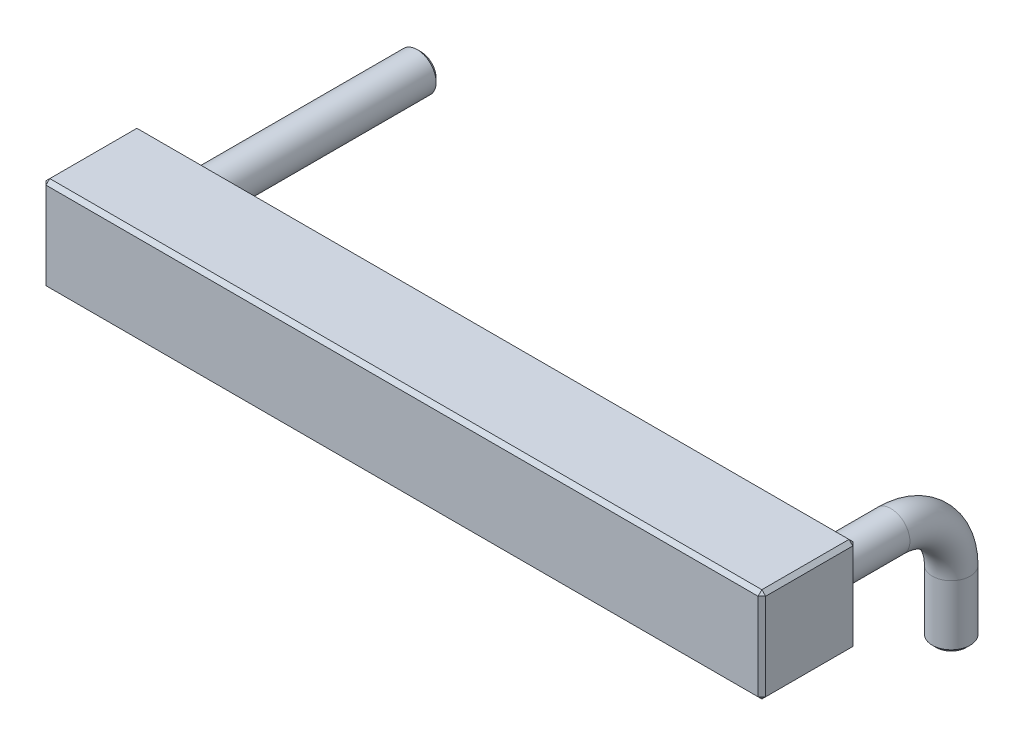
ISO-10303-21;
HEADER;
FILE_DESCRIPTION(('STEP AP214'),'2;1');
FILE_NAME('part.step','',(''),(''),'','','');
FILE_SCHEMA(('AUTOMOTIVE_DESIGN { 1 0 10303 214 1 1 1 1 }'));
ENDSEC;
DATA;
#1=APPLICATION_CONTEXT('core data for automotive mechanical design processes');
#2=APPLICATION_PROTOCOL_DEFINITION('international standard','automotive_design',2000,#1);
#3=PRODUCT_CONTEXT('',#1,'mechanical');
#4=PRODUCT('Part','Part','',(#3));
#5=PRODUCT_RELATED_PRODUCT_CATEGORY('part','',(#4));
#6=PRODUCT_DEFINITION_FORMATION('','',#4);
#7=PRODUCT_DEFINITION_CONTEXT('part definition',#1,'design');
#8=PRODUCT_DEFINITION('design','',#6,#7);
#9=PRODUCT_DEFINITION_SHAPE('','',#8);
#10=(LENGTH_UNIT() NAMED_UNIT(*) SI_UNIT(.MILLI.,.METRE.));
#11=(NAMED_UNIT(*) PLANE_ANGLE_UNIT() SI_UNIT($,.RADIAN.));
#12=(NAMED_UNIT(*) SI_UNIT($,.STERADIAN.) SOLID_ANGLE_UNIT());
#13=UNCERTAINTY_MEASURE_WITH_UNIT(LENGTH_MEASURE(1.E-05),#10,'distance_accuracy_value','');
#14=(GEOMETRIC_REPRESENTATION_CONTEXT(3) GLOBAL_UNCERTAINTY_ASSIGNED_CONTEXT((#13)) GLOBAL_UNIT_ASSIGNED_CONTEXT((#10,
#11,#12)) REPRESENTATION_CONTEXT('',''));
#15=CARTESIAN_POINT('',(0.,0.,0.));
#16=DIRECTION('',(0.,0.,1.));
#17=DIRECTION('',(1.,0.,0.));
#18=AXIS2_PLACEMENT_3D('',#15,#16,#17);
#19=CARTESIAN_POINT('',(19.,1.25,3.5));
#20=DIRECTION('',(0.,0.,1.));
#21=DIRECTION('',(0.,-1.,0.));
#22=AXIS2_PLACEMENT_3D('',#19,#20,#21);
#23=PLANE('',#22);
#24=CARTESIAN_POINT('',(1.25,0.,3.5));
#25=DIRECTION('',(0.,0.,1.));
#26=DIRECTION('',(0.,-1.,0.));
#27=AXIS2_PLACEMENT_3D('',#24,#25,#26);
#28=CIRCLE('',#27,0.599999999999996);
#29=CARTESIAN_POINT('',(1.25,-0.599999999999997,3.5));
#30=VERTEX_POINT('',#29);
#31=EDGE_CURVE('E205',#30,#30,#28,.T.);
#32=ORIENTED_EDGE('',*,*,#31,.T.);
#33=EDGE_LOOP('',(#32));
#34=FACE_BOUND('',#33,.T.);
#35=CARTESIAN_POINT('',(18.,0.,3.5));
#36=DIRECTION('',(0.,0.,1.));
#37=DIRECTION('',(0.,-1.,0.));
#38=AXIS2_PLACEMENT_3D('',#35,#36,#37);
#39=CIRCLE('',#38,0.599999999999993);
#40=CARTESIAN_POINT('',(18.,-0.599999999999995,3.5));
#41=VERTEX_POINT('',#40);
#42=EDGE_CURVE('E202',#41,#41,#39,.T.);
#43=ORIENTED_EDGE('',*,*,#42,.T.);
#44=EDGE_LOOP('',(#43));
#45=FACE_BOUND('',#44,.T.);
#46=DIRECTION('',(0.,-1.,0.));
#47=VECTOR('',#46,1.);
#48=CARTESIAN_POINT('',(18.9,-1.25,3.5));
#49=LINE('',#48,#47);
#50=CARTESIAN_POINT('',(18.9,1.15,3.5));
#51=VERTEX_POINT('',#50);
#52=CARTESIAN_POINT('',(18.9,-1.15,3.5));
#53=VERTEX_POINT('',#52);
#54=EDGE_CURVE('E167',#51,#53,#49,.T.);
#55=ORIENTED_EDGE('',*,*,#54,.T.);
#56=DIRECTION('',(-1.,0.,0.));
#57=VECTOR('',#56,1.);
#58=CARTESIAN_POINT('',(19.,-1.15,3.5));
#59=LINE('',#58,#57);
#60=CARTESIAN_POINT('',(0.0999999999999994,-1.15,3.5));
#61=VERTEX_POINT('',#60);
#62=EDGE_CURVE('E163',#53,#61,#59,.T.);
#63=ORIENTED_EDGE('',*,*,#62,.T.);
#64=DIRECTION('',(0.,1.,0.));
#65=VECTOR('',#64,1.);
#66=CARTESIAN_POINT('',(0.0999999999999994,1.25,3.5));
#67=LINE('',#66,#65);
#68=CARTESIAN_POINT('',(0.0999999999999994,1.15,3.5));
#69=VERTEX_POINT('',#68);
#70=EDGE_CURVE('E156',#61,#69,#67,.T.);
#71=ORIENTED_EDGE('',*,*,#70,.T.);
#72=DIRECTION('',(1.,0.,0.));
#73=VECTOR('',#72,1.);
#74=CARTESIAN_POINT('',(19.,1.15,3.5));
#75=LINE('',#74,#73);
#76=EDGE_CURVE('E160',#69,#51,#75,.T.);
#77=ORIENTED_EDGE('',*,*,#76,.T.);
#78=EDGE_LOOP('',(#55,#63,#71,#77));
#79=FACE_BOUND('',#78,.T.);
#80=ADVANCED_FACE('F68',(#34,#45,#79),#23,.F.);
#81=CARTESIAN_POINT('',(19.,1.25,6.));
#82=DIRECTION('',(0.,-1.,0.));
#83=DIRECTION('',(0.,0.,-1.));
#84=AXIS2_PLACEMENT_3D('',#81,#82,#83);
#85=PLANE('',#84);
#86=DIRECTION('',(0.,0.,-1.));
#87=VECTOR('',#86,1.);
#88=CARTESIAN_POINT('',(18.9,1.25,3.5));
#89=LINE('',#88,#87);
#90=CARTESIAN_POINT('',(18.9,1.25,5.9));
#91=VERTEX_POINT('',#90);
#92=CARTESIAN_POINT('',(18.9,1.25,3.6));
#93=VERTEX_POINT('',#92);
#94=EDGE_CURVE('E77',#91,#93,#89,.T.);
#95=ORIENTED_EDGE('',*,*,#94,.T.);
#96=DIRECTION('',(-1.,0.,0.));
#97=VECTOR('',#96,1.);
#98=CARTESIAN_POINT('',(19.,1.25,3.6));
#99=LINE('',#98,#97);
#100=CARTESIAN_POINT('',(0.0999999999999994,1.25,3.6));
#101=VERTEX_POINT('',#100);
#102=EDGE_CURVE('E13',#93,#101,#99,.T.);
#103=ORIENTED_EDGE('',*,*,#102,.T.);
#104=DIRECTION('',(0.,0.,1.));
#105=VECTOR('',#104,1.);
#106=CARTESIAN_POINT('',(0.0999999999999994,1.25,6.));
#107=LINE('',#106,#105);
#108=CARTESIAN_POINT('',(0.0999999999999994,1.25,5.9));
#109=VERTEX_POINT('',#108);
#110=EDGE_CURVE('E245',#101,#109,#107,.T.);
#111=ORIENTED_EDGE('',*,*,#110,.T.);
#112=DIRECTION('',(1.,0.,0.));
#113=VECTOR('',#112,1.);
#114=CARTESIAN_POINT('',(19.,1.25,5.9));
#115=LINE('',#114,#113);
#116=EDGE_CURVE('E88',#109,#91,#115,.T.);
#117=ORIENTED_EDGE('',*,*,#116,.T.);
#118=EDGE_LOOP('',(#95,#103,#111,#117));
#119=FACE_BOUND('',#118,.T.);
#120=ADVANCED_FACE('F345',(#119),#85,.F.);
#121=CARTESIAN_POINT('',(19.,1.25,6.));
#122=DIRECTION('',(0.,0.,-1.));
#123=DIRECTION('',(-1.,0.,0.));
#124=AXIS2_PLACEMENT_3D('',#121,#122,#123);
#125=PLANE('',#124);
#126=DIRECTION('',(1.,0.,0.));
#127=VECTOR('',#126,1.);
#128=CARTESIAN_POINT('',(19.,-1.15,6.));
#129=LINE('',#128,#127);
#130=CARTESIAN_POINT('',(0.0999999999999994,-1.15,6.));
#131=VERTEX_POINT('',#130);
#132=CARTESIAN_POINT('',(18.9,-1.15,6.));
#133=VERTEX_POINT('',#132);
#134=EDGE_CURVE('E240',#131,#133,#129,.T.);
#135=ORIENTED_EDGE('',*,*,#134,.T.);
#136=DIRECTION('',(0.,1.,0.));
#137=VECTOR('',#136,1.);
#138=CARTESIAN_POINT('',(18.9,1.25,6.));
#139=LINE('',#138,#137);
#140=CARTESIAN_POINT('',(18.9,1.15,6.));
#141=VERTEX_POINT('',#140);
#142=EDGE_CURVE('E242',#133,#141,#139,.T.);
#143=ORIENTED_EDGE('',*,*,#142,.T.);
#144=DIRECTION('',(-1.,0.,0.));
#145=VECTOR('',#144,1.);
#146=CARTESIAN_POINT('',(19.,1.15,6.));
#147=LINE('',#146,#145);
#148=CARTESIAN_POINT('',(0.0999999999999994,1.15,6.));
#149=VERTEX_POINT('',#148);
#150=EDGE_CURVE('E236',#141,#149,#147,.T.);
#151=ORIENTED_EDGE('',*,*,#150,.T.);
#152=DIRECTION('',(0.,-1.,0.));
#153=VECTOR('',#152,1.);
#154=CARTESIAN_POINT('',(0.0999999999999994,1.25,6.));
#155=LINE('',#154,#153);
#156=EDGE_CURVE('E238',#149,#131,#155,.T.);
#157=ORIENTED_EDGE('',*,*,#156,.T.);
#158=EDGE_LOOP('',(#135,#143,#151,#157));
#159=FACE_BOUND('',#158,.T.);
#160=ADVANCED_FACE('F351',(#159),#125,.F.);
#161=CARTESIAN_POINT('',(19.,-1.25,6.));
#162=DIRECTION('',(0.,1.,0.));
#163=DIRECTION('',(0.,0.,1.));
#164=AXIS2_PLACEMENT_3D('',#161,#162,#163);
#165=PLANE('',#164);
#166=DIRECTION('',(1.,0.,0.));
#167=VECTOR('',#166,1.);
#168=CARTESIAN_POINT('',(19.,-1.25,3.6));
#169=LINE('',#168,#167);
#170=CARTESIAN_POINT('',(0.0999999999999994,-1.25,3.6));
#171=VERTEX_POINT('',#170);
#172=CARTESIAN_POINT('',(18.9,-1.25,3.6));
#173=VERTEX_POINT('',#172);
#174=EDGE_CURVE('E231',#171,#173,#169,.T.);
#175=ORIENTED_EDGE('',*,*,#174,.T.);
#176=DIRECTION('',(0.,0.,1.));
#177=VECTOR('',#176,1.);
#178=CARTESIAN_POINT('',(18.9,-1.25,6.));
#179=LINE('',#178,#177);
#180=CARTESIAN_POINT('',(18.9,-1.25,5.9));
#181=VERTEX_POINT('',#180);
#182=EDGE_CURVE('E233',#173,#181,#179,.T.);
#183=ORIENTED_EDGE('',*,*,#182,.T.);
#184=DIRECTION('',(-1.,0.,0.));
#185=VECTOR('',#184,1.);
#186=CARTESIAN_POINT('',(19.,-1.25,5.9));
#187=LINE('',#186,#185);
#188=CARTESIAN_POINT('',(0.0999999999999994,-1.25,5.9));
#189=VERTEX_POINT('',#188);
#190=EDGE_CURVE('E227',#181,#189,#187,.T.);
#191=ORIENTED_EDGE('',*,*,#190,.T.);
#192=DIRECTION('',(0.,0.,-1.));
#193=VECTOR('',#192,1.);
#194=CARTESIAN_POINT('',(0.0999999999999994,-1.25,6.));
#195=LINE('',#194,#193);
#196=EDGE_CURVE('E229',#189,#171,#195,.T.);
#197=ORIENTED_EDGE('',*,*,#196,.T.);
#198=EDGE_LOOP('',(#175,#183,#191,#197));
#199=FACE_BOUND('',#198,.T.);
#200=ADVANCED_FACE('F396',(#199),#165,.F.);
#201=CARTESIAN_POINT('',(19.,0.,0.));
#202=DIRECTION('',(1.,0.,0.));
#203=DIRECTION('',(0.,0.,-1.));
#204=AXIS2_PLACEMENT_3D('',#201,#202,#203);
#205=PLANE('',#204);
#206=DIRECTION('',(0.,0.,-1.));
#207=VECTOR('',#206,1.);
#208=CARTESIAN_POINT('',(19.,-1.15,3.5));
#209=LINE('',#208,#207);
#210=CARTESIAN_POINT('',(19.,-1.15,5.9));
#211=VERTEX_POINT('',#210);
#212=CARTESIAN_POINT('',(19.,-1.15,3.6));
#213=VERTEX_POINT('',#212);
#214=EDGE_CURVE('E215',#211,#213,#209,.T.);
#215=ORIENTED_EDGE('',*,*,#214,.T.);
#216=DIRECTION('',(0.,1.,0.));
#217=VECTOR('',#216,1.);
#218=CARTESIAN_POINT('',(19.,1.25,3.6));
#219=LINE('',#218,#217);
#220=CARTESIAN_POINT('',(19.,1.15,3.6));
#221=VERTEX_POINT('',#220);
#222=EDGE_CURVE('E217',#213,#221,#219,.T.);
#223=ORIENTED_EDGE('',*,*,#222,.T.);
#224=DIRECTION('',(0.,0.,1.));
#225=VECTOR('',#224,1.);
#226=CARTESIAN_POINT('',(19.,1.15,6.));
#227=LINE('',#226,#225);
#228=CARTESIAN_POINT('',(19.,1.15,5.9));
#229=VERTEX_POINT('',#228);
#230=EDGE_CURVE('E211',#221,#229,#227,.T.);
#231=ORIENTED_EDGE('',*,*,#230,.T.);
#232=DIRECTION('',(0.,-1.,0.));
#233=VECTOR('',#232,1.);
#234=CARTESIAN_POINT('',(19.,-1.25,5.9));
#235=LINE('',#234,#233);
#236=EDGE_CURVE('E213',#229,#211,#235,.T.);
#237=ORIENTED_EDGE('',*,*,#236,.T.);
#238=EDGE_LOOP('',(#215,#223,#231,#237));
#239=FACE_BOUND('',#238,.T.);
#240=ADVANCED_FACE('F393',(#239),#205,.T.);
#241=CARTESIAN_POINT('',(0.,0.,0.));
#242=DIRECTION('',(1.,0.,0.));
#243=DIRECTION('',(0.,0.,-1.));
#244=AXIS2_PLACEMENT_3D('',#241,#242,#243);
#245=PLANE('',#244);
#246=DIRECTION('',(0.,0.,-1.));
#247=VECTOR('',#246,1.);
#248=CARTESIAN_POINT('',(0.,1.15,0.));
#249=LINE('',#248,#247);
#250=CARTESIAN_POINT('',(0.,1.15,5.9));
#251=VERTEX_POINT('',#250);
#252=CARTESIAN_POINT('',(0.,1.15,3.6));
#253=VERTEX_POINT('',#252);
#254=EDGE_CURVE('E220',#251,#253,#249,.T.);
#255=ORIENTED_EDGE('',*,*,#254,.T.);
#256=DIRECTION('',(0.,-1.,0.));
#257=VECTOR('',#256,1.);
#258=CARTESIAN_POINT('',(0.,0.,3.6));
#259=LINE('',#258,#257);
#260=CARTESIAN_POINT('',(0.,-1.15,3.6));
#261=VERTEX_POINT('',#260);
#262=EDGE_CURVE('E175',#253,#261,#259,.T.);
#263=ORIENTED_EDGE('',*,*,#262,.T.);
#264=DIRECTION('',(0.,0.,1.));
#265=VECTOR('',#264,1.);
#266=CARTESIAN_POINT('',(0.,-1.15,0.));
#267=LINE('',#266,#265);
#268=CARTESIAN_POINT('',(0.,-1.15,5.9));
#269=VERTEX_POINT('',#268);
#270=EDGE_CURVE('E224',#261,#269,#267,.T.);
#271=ORIENTED_EDGE('',*,*,#270,.T.);
#272=DIRECTION('',(0.,1.,0.));
#273=VECTOR('',#272,1.);
#274=CARTESIAN_POINT('',(0.,0.,5.9));
#275=LINE('',#274,#273);
#276=EDGE_CURVE('E222',#269,#251,#275,.T.);
#277=ORIENTED_EDGE('',*,*,#276,.T.);
#278=EDGE_LOOP('',(#255,#263,#271,#277));
#279=FACE_BOUND('',#278,.T.);
#280=ADVANCED_FACE('F391',(#279),#245,.F.);
#281=CARTESIAN_POINT('',(1.25,0.,-2.75));
#282=DIRECTION('',(0.,0.,1.));
#283=DIRECTION('',(0.,-1.,0.));
#284=AXIS2_PLACEMENT_3D('',#281,#282,#283);
#285=CYLINDRICAL_SURFACE('',#284,0.5);
#286=CARTESIAN_POINT('',(1.25,0.,-2.65));
#287=DIRECTION('',(0.,0.,-1.));
#288=DIRECTION('',(0.,1.,0.));
#289=AXIS2_PLACEMENT_3D('',#286,#287,#288);
#290=CIRCLE('',#289,0.5);
#291=CARTESIAN_POINT('',(1.25,0.500000000000001,-2.65));
#292=VERTEX_POINT('',#291);
#293=EDGE_CURVE('E193',#292,#292,#290,.F.);
#294=ORIENTED_EDGE('',*,*,#293,.T.);
#295=EDGE_LOOP('',(#294));
#296=FACE_BOUND('',#295,.T.);
#297=CARTESIAN_POINT('',(1.25,0.,3.4));
#298=DIRECTION('',(0.,0.,1.));
#299=DIRECTION('',(0.,-1.,0.));
#300=AXIS2_PLACEMENT_3D('',#297,#298,#299);
#301=CIRCLE('',#300,0.5);
#302=CARTESIAN_POINT('',(1.25,-0.500000000000001,3.4));
#303=VERTEX_POINT('',#302);
#304=EDGE_CURVE('E196',#303,#303,#301,.F.);
#305=ORIENTED_EDGE('',*,*,#304,.T.);
#306=EDGE_LOOP('',(#305));
#307=FACE_BOUND('',#306,.T.);
#308=ADVANCED_FACE('F326',(#296,#307),#285,.T.);
#309=CARTESIAN_POINT('',(0.,0.,-2.75));
#310=DIRECTION('',(0.,0.,-1.));
#311=DIRECTION('',(0.,1.,0.));
#312=AXIS2_PLACEMENT_3D('',#309,#310,#311);
#313=PLANE('',#312);
#314=CARTESIAN_POINT('',(1.25,0.,-2.75));
#315=DIRECTION('',(0.,0.,-1.));
#316=DIRECTION('',(0.,1.,0.));
#317=AXIS2_PLACEMENT_3D('',#314,#315,#316);
#318=CIRCLE('',#317,0.400000000000005);
#319=CARTESIAN_POINT('',(1.25,0.400000000000005,-2.75));
#320=VERTEX_POINT('',#319);
#321=EDGE_CURVE('E321',#320,#320,#318,.T.);
#322=ORIENTED_EDGE('',*,*,#321,.T.);
#323=EDGE_LOOP('',(#322));
#324=FACE_BOUND('',#323,.T.);
#325=ADVANCED_FACE('F383',(#324),#313,.T.);
#326=CARTESIAN_POINT('',(18.,0.,-2.58845056908104));
#327=DIRECTION('',(0.,0.,1.));
#328=DIRECTION('',(0.,-1.,0.));
#329=AXIS2_PLACEMENT_3D('',#326,#327,#328);
#330=CYLINDRICAL_SURFACE('',#329,0.499999999999999);
#331=CARTESIAN_POINT('',(18.,0.,3.40000000000001));
#332=DIRECTION('',(0.,0.,1.));
#333=DIRECTION('',(0.,-1.,0.));
#334=AXIS2_PLACEMENT_3D('',#331,#332,#333);
#335=CIRCLE('',#334,0.499999999999999);
#336=CARTESIAN_POINT('',(18.,-0.500000000000001,3.40000000000001));
#337=VERTEX_POINT('',#336);
#338=EDGE_CURVE('E208',#337,#337,#335,.F.);
#339=ORIENTED_EDGE('',*,*,#338,.T.);
#340=EDGE_LOOP('',(#339));
#341=FACE_BOUND('',#340,.T.);
#342=CARTESIAN_POINT('',(18.,0.,1.59154943091895));
#343=DIRECTION('',(0.,0.,1.));
#344=DIRECTION('',(1.,0.,0.));
#345=AXIS2_PLACEMENT_3D('',#342,#343,#344);
#346=CIRCLE('',#345,0.499999999999999);
#347=CARTESIAN_POINT('',(18.,0.499999999999998,1.59154943091895));
#348=VERTEX_POINT('',#347);
#349=EDGE_CURVE('E302',#348,#348,#346,.T.);
#350=ORIENTED_EDGE('',*,*,#349,.T.);
#351=EDGE_LOOP('',(#350));
#352=FACE_BOUND('',#351,.T.);
#353=ADVANCED_FACE('F372',(#341,#352),#330,.T.);
#354=CARTESIAN_POINT('',(18.,-3.27154943091896,0.));
#355=DIRECTION('',(0.,1.,0.));
#356=DIRECTION('',(0.,0.,1.));
#357=AXIS2_PLACEMENT_3D('',#354,#355,#356);
#358=CYLINDRICAL_SURFACE('',#357,0.499999999999999);
#359=CARTESIAN_POINT('',(18.,-3.17154943091895,0.));
#360=DIRECTION('',(0.,-1.,0.));
#361=DIRECTION('',(0.,0.,-1.));
#362=AXIS2_PLACEMENT_3D('',#359,#360,#361);
#363=CIRCLE('',#362,0.499999999999999);
#364=CARTESIAN_POINT('',(18.,-3.17154943091896,-0.49999999999999));
#365=VERTEX_POINT('',#364);
#366=EDGE_CURVE('E318',#365,#365,#363,.F.);
#367=ORIENTED_EDGE('',*,*,#366,.T.);
#368=EDGE_LOOP('',(#367));
#369=FACE_BOUND('',#368,.T.);
#370=CARTESIAN_POINT('',(18.,-1.59154943091896,0.));
#371=DIRECTION('',(0.,1.,0.));
#372=DIRECTION('',(1.,0.,0.));
#373=AXIS2_PLACEMENT_3D('',#370,#371,#372);
#374=CIRCLE('',#373,0.499999999999999);
#375=CARTESIAN_POINT('',(18.,-1.59154943091896,-0.499999999999994));
#376=VERTEX_POINT('',#375);
#377=EDGE_CURVE('E308',#376,#376,#374,.T.);
#378=ORIENTED_EDGE('',*,*,#377,.F.);
#379=EDGE_LOOP('',(#378));
#380=FACE_BOUND('',#379,.T.);
#381=ADVANCED_FACE('F369',(#369,#380),#358,.T.);
#382=CARTESIAN_POINT('',(18.,-1.59154943091895,1.59154943091895));
#383=DIRECTION('',(1.,0.,0.));
#384=DIRECTION('',(0.,0.541121252126874,-0.84094458229817));
#385=AXIS2_PLACEMENT_3D('',#382,#383,#384);
#386=TOROIDAL_SURFACE('',#385,1.59154943091895,0.499999999999999);
#387=CARTESIAN_POINT('',(18.,-1.59154943091895,1.59154943091895));
#388=DIRECTION('',(1.,0.,0.));
#389=DIRECTION('',(0.,0.541121252126874,-0.84094458229817));
#390=AXIS2_PLACEMENT_3D('',#387,#388,#389);
#391=CIRCLE('',#390,2.09154943091895);
#392=EDGE_CURVE('',#376,#348,#391,.T.);
#393=ORIENTED_EDGE('',*,*,#377,.T.);
#394=ORIENTED_EDGE('',*,*,#349,.F.);
#395=ORIENTED_EDGE('',*,*,#392,.T.);
#396=ORIENTED_EDGE('',*,*,#392,.F.);
#397=EDGE_LOOP('',(#393,#395,#394,#396));
#398=FACE_BOUND('',#397,.T.);
#399=ADVANCED_FACE('F362',(#398),#386,.T.);
#400=CARTESIAN_POINT('',(0.,-3.27154943091896,0.));
#401=DIRECTION('',(0.,-1.,0.));
#402=DIRECTION('',(0.,0.,-1.));
#403=AXIS2_PLACEMENT_3D('',#400,#401,#402);
#404=PLANE('',#403);
#405=CARTESIAN_POINT('',(18.,-3.27154943091896,0.));
#406=DIRECTION('',(0.,-1.,0.));
#407=DIRECTION('',(0.,0.,-1.));
#408=AXIS2_PLACEMENT_3D('',#405,#406,#407);
#409=CIRCLE('',#408,0.399999999999998);
#410=CARTESIAN_POINT('',(18.,-3.27154943091896,-0.399999999999988));
#411=VERTEX_POINT('',#410);
#412=EDGE_CURVE('E313',#411,#411,#409,.T.);
#413=ORIENTED_EDGE('',*,*,#412,.T.);
#414=EDGE_LOOP('',(#413));
#415=FACE_BOUND('',#414,.T.);
#416=ADVANCED_FACE('F357',(#415),#404,.T.);
#417=CARTESIAN_POINT('',(18.,-3.27154943091896,0.));
#418=DIRECTION('',(0.,1.,0.));
#419=DIRECTION('',(0.,0.,1.));
#420=AXIS2_PLACEMENT_3D('',#417,#418,#419);
#421=CONICAL_SURFACE('',#420,0.399999999999998,0.785398163397445);
#422=ORIENTED_EDGE('',*,*,#366,.F.);
#423=EDGE_LOOP('',(#422));
#424=FACE_BOUND('',#423,.T.);
#425=ORIENTED_EDGE('',*,*,#412,.F.);
#426=EDGE_LOOP('',(#425));
#427=FACE_BOUND('',#426,.T.);
#428=ADVANCED_FACE('F340',(#424,#427),#421,.T.);
#429=CARTESIAN_POINT('',(1.25,0.,-2.75));
#430=DIRECTION('',(0.,0.,1.));
#431=DIRECTION('',(0.,-1.,0.));
#432=AXIS2_PLACEMENT_3D('',#429,#430,#431);
#433=CONICAL_SURFACE('',#432,0.400000000000005,0.78539816339744);
#434=ORIENTED_EDGE('',*,*,#293,.F.);
#435=EDGE_LOOP('',(#434));
#436=FACE_BOUND('',#435,.T.);
#437=ORIENTED_EDGE('',*,*,#321,.F.);
#438=EDGE_LOOP('',(#437));
#439=FACE_BOUND('',#438,.T.);
#440=ADVANCED_FACE('F331',(#436,#439),#433,.T.);
#441=CARTESIAN_POINT('',(1.25,0.,3.4));
#442=DIRECTION('',(0.,0.,1.));
#443=DIRECTION('',(0.,-1.,0.));
#444=AXIS2_PLACEMENT_3D('',#441,#442,#443);
#445=CONICAL_SURFACE('',#444,0.5,0.785398163397432);
#446=ORIENTED_EDGE('',*,*,#31,.F.);
#447=EDGE_LOOP('',(#446));
#448=FACE_BOUND('',#447,.T.);
#449=ORIENTED_EDGE('',*,*,#304,.F.);
#450=EDGE_LOOP('',(#449));
#451=FACE_BOUND('',#450,.T.);
#452=ADVANCED_FACE('F328',(#448,#451),#445,.T.);
#453=CARTESIAN_POINT('',(18.,0.,3.40000000000001));
#454=DIRECTION('',(0.,0.,1.));
#455=DIRECTION('',(0.,-1.,0.));
#456=AXIS2_PLACEMENT_3D('',#453,#454,#455);
#457=CONICAL_SURFACE('',#456,0.499999999999999,0.785398163397446);
#458=ORIENTED_EDGE('',*,*,#42,.F.);
#459=EDGE_LOOP('',(#458));
#460=FACE_BOUND('',#459,.T.);
#461=ORIENTED_EDGE('',*,*,#338,.F.);
#462=EDGE_LOOP('',(#461));
#463=FACE_BOUND('',#462,.T.);
#464=ADVANCED_FACE('F330',(#460,#463),#457,.T.);
#465=CARTESIAN_POINT('',(0.0999999999999994,1.25,6.));
#466=DIRECTION('',(0.70710678118656,0.,-0.707106781186535));
#467=DIRECTION('',(0.,-1.,0.));
#468=AXIS2_PLACEMENT_3D('',#465,#466,#467);
#469=PLANE('',#468);
#470=DIRECTION('',(0.707106781186535,0.,0.70710678118656));
#471=VECTOR('',#470,1.);
#472=CARTESIAN_POINT('',(0.,-1.15,5.9));
#473=LINE('',#472,#471);
#474=EDGE_CURVE('E72',#131,#269,#473,.F.);
#475=ORIENTED_EDGE('',*,*,#474,.F.);
#476=ORIENTED_EDGE('',*,*,#156,.F.);
#477=DIRECTION('',(-0.707106781186535,0.,-0.70710678118656));
#478=VECTOR('',#477,1.);
#479=CARTESIAN_POINT('',(0.,1.15,5.9));
#480=LINE('',#479,#478);
#481=EDGE_CURVE('E295',#251,#149,#480,.F.);
#482=ORIENTED_EDGE('',*,*,#481,.F.);
#483=ORIENTED_EDGE('',*,*,#276,.F.);
#484=EDGE_LOOP('',(#475,#476,#482,#483));
#485=FACE_BOUND('',#484,.T.);
#486=ADVANCED_FACE('F70',(#485),#469,.F.);
#487=CARTESIAN_POINT('',(0.,-1.15,5.9));
#488=DIRECTION('',(-0.577350269189642,-0.577350269189612,0.577350269189622));
#489=DIRECTION('',(0.707106781186535,0.,0.70710678118656));
#490=AXIS2_PLACEMENT_3D('',#487,#488,#489);
#491=PLANE('',#490);
#492=DIRECTION('',(0.,-0.707106781186554,-0.707106781186541));
#493=VECTOR('',#492,1.);
#494=CARTESIAN_POINT('',(0.0999999999999994,-1.2,5.95));
#495=LINE('',#494,#493);
#496=EDGE_CURVE('E290',#131,#189,#495,.T.);
#497=ORIENTED_EDGE('',*,*,#496,.F.);
#498=ORIENTED_EDGE('',*,*,#474,.T.);
#499=DIRECTION('',(-0.707106781186535,0.70710678118656,0.));
#500=VECTOR('',#499,1.);
#501=CARTESIAN_POINT('',(0.,-1.15,5.9));
#502=LINE('',#501,#500);
#503=EDGE_CURVE('E293',#189,#269,#502,.T.);
#504=ORIENTED_EDGE('',*,*,#503,.F.);
#505=EDGE_LOOP('',(#497,#498,#504));
#506=FACE_BOUND('',#505,.T.);
#507=ADVANCED_FACE('F464',(#506),#491,.T.);
#508=CARTESIAN_POINT('',(0.,1.15,5.9));
#509=DIRECTION('',(-0.577350269189642,0.577350269189612,0.577350269189622));
#510=DIRECTION('',(0.707106781186535,0.,0.70710678118656));
#511=AXIS2_PLACEMENT_3D('',#508,#509,#510);
#512=PLANE('',#511);
#513=DIRECTION('',(0.707106781186535,0.70710678118656,0.));
#514=VECTOR('',#513,1.);
#515=CARTESIAN_POINT('',(0.,1.15,5.9));
#516=LINE('',#515,#514);
#517=EDGE_CURVE('E284',#251,#109,#516,.T.);
#518=ORIENTED_EDGE('',*,*,#517,.F.);
#519=ORIENTED_EDGE('',*,*,#481,.T.);
#520=DIRECTION('',(0.,-0.707106781186554,0.707106781186541));
#521=VECTOR('',#520,1.);
#522=CARTESIAN_POINT('',(0.0999999999999994,1.2,5.95));
#523=LINE('',#522,#521);
#524=EDGE_CURVE('E287',#109,#149,#523,.T.);
#525=ORIENTED_EDGE('',*,*,#524,.F.);
#526=EDGE_LOOP('',(#518,#519,#525));
#527=FACE_BOUND('',#526,.T.);
#528=ADVANCED_FACE('F460',(#527),#512,.T.);
#529=CARTESIAN_POINT('',(0.0999999999999994,-1.25,6.));
#530=DIRECTION('',(0.70710678118656,0.707106781186535,0.));
#531=DIRECTION('',(0.,0.,-1.));
#532=AXIS2_PLACEMENT_3D('',#529,#530,#531);
#533=PLANE('',#532);
#534=ORIENTED_EDGE('',*,*,#503,.T.);
#535=ORIENTED_EDGE('',*,*,#270,.F.);
#536=DIRECTION('',(0.707106781186535,-0.70710678118656,0.));
#537=VECTOR('',#536,1.);
#538=CARTESIAN_POINT('',(0.,-1.15,3.6));
#539=LINE('',#538,#537);
#540=EDGE_CURVE('E280',#171,#261,#539,.F.);
#541=ORIENTED_EDGE('',*,*,#540,.F.);
#542=ORIENTED_EDGE('',*,*,#196,.F.);
#543=EDGE_LOOP('',(#534,#535,#541,#542));
#544=FACE_BOUND('',#543,.T.);
#545=ADVANCED_FACE('F454',(#544),#533,.F.);
#546=CARTESIAN_POINT('',(19.,-1.25,5.9));
#547=DIRECTION('',(0.,0.707106781186541,-0.707106781186554));
#548=DIRECTION('',(-1.,0.,0.));
#549=AXIS2_PLACEMENT_3D('',#546,#547,#548);
#550=PLANE('',#549);
#551=ORIENTED_EDGE('',*,*,#496,.T.);
#552=ORIENTED_EDGE('',*,*,#190,.F.);
#553=DIRECTION('',(0.,0.707106781186554,0.707106781186541));
#554=VECTOR('',#553,1.);
#555=CARTESIAN_POINT('',(18.9,-1.25,5.9));
#556=LINE('',#555,#554);
#557=EDGE_CURVE('E277',#133,#181,#556,.F.);
#558=ORIENTED_EDGE('',*,*,#557,.F.);
#559=ORIENTED_EDGE('',*,*,#134,.F.);
#560=EDGE_LOOP('',(#551,#552,#558,#559));
#561=FACE_BOUND('',#560,.T.);
#562=ADVANCED_FACE('F420',(#561),#550,.F.);
#563=CARTESIAN_POINT('',(19.,0.,5.9));
#564=DIRECTION('',(0.707106781186541,0.,0.707106781186554));
#565=DIRECTION('',(0.,1.,0.));
#566=AXIS2_PLACEMENT_3D('',#563,#564,#565);
#567=PLANE('',#566);
#568=DIRECTION('',(0.707106781186554,0.,-0.707106781186541));
#569=VECTOR('',#568,1.);
#570=CARTESIAN_POINT('',(18.9,1.15,6.));
#571=LINE('',#570,#569);
#572=EDGE_CURVE('E271',#141,#229,#571,.T.);
#573=ORIENTED_EDGE('',*,*,#572,.F.);
#574=ORIENTED_EDGE('',*,*,#142,.F.);
#575=DIRECTION('',(-0.707106781186554,0.,0.707106781186541));
#576=VECTOR('',#575,1.);
#577=CARTESIAN_POINT('',(18.95,-1.15,5.95));
#578=LINE('',#577,#576);
#579=EDGE_CURVE('E274',#211,#133,#578,.T.);
#580=ORIENTED_EDGE('',*,*,#579,.F.);
#581=ORIENTED_EDGE('',*,*,#236,.F.);
#582=EDGE_LOOP('',(#573,#574,#580,#581));
#583=FACE_BOUND('',#582,.T.);
#584=ADVANCED_FACE('F415',(#583),#567,.T.);
#585=CARTESIAN_POINT('',(19.,1.15,6.));
#586=DIRECTION('',(0.,-0.707106781186541,-0.707106781186554));
#587=DIRECTION('',(-1.,0.,0.));
#588=AXIS2_PLACEMENT_3D('',#585,#586,#587);
#589=PLANE('',#588);
#590=ORIENTED_EDGE('',*,*,#524,.T.);
#591=ORIENTED_EDGE('',*,*,#150,.F.);
#592=DIRECTION('',(0.,0.707106781186554,-0.707106781186541));
#593=VECTOR('',#592,1.);
#594=CARTESIAN_POINT('',(18.9,1.15,6.));
#595=LINE('',#594,#593);
#596=EDGE_CURVE('E269',#91,#141,#595,.F.);
#597=ORIENTED_EDGE('',*,*,#596,.F.);
#598=ORIENTED_EDGE('',*,*,#116,.F.);
#599=EDGE_LOOP('',(#590,#591,#597,#598));
#600=FACE_BOUND('',#599,.T.);
#601=ADVANCED_FACE('F462',(#600),#589,.F.);
#602=CARTESIAN_POINT('',(0.0999999999999994,1.25,6.));
#603=DIRECTION('',(0.70710678118656,-0.707106781186535,0.));
#604=DIRECTION('',(0.,0.,1.));
#605=AXIS2_PLACEMENT_3D('',#602,#603,#604);
#606=PLANE('',#605);
#607=ORIENTED_EDGE('',*,*,#517,.T.);
#608=ORIENTED_EDGE('',*,*,#110,.F.);
#609=DIRECTION('',(-0.707106781186535,-0.70710678118656,0.));
#610=VECTOR('',#609,1.);
#611=CARTESIAN_POINT('',(0.0499999999999986,1.2,3.6));
#612=LINE('',#611,#610);
#613=EDGE_CURVE('E179',#253,#101,#612,.F.);
#614=ORIENTED_EDGE('',*,*,#613,.F.);
#615=ORIENTED_EDGE('',*,*,#254,.F.);
#616=EDGE_LOOP('',(#607,#608,#614,#615));
#617=FACE_BOUND('',#616,.T.);
#618=ADVANCED_FACE('F459',(#617),#606,.F.);
#619=CARTESIAN_POINT('',(0.0999999999999994,1.25,3.5));
#620=DIRECTION('',(0.707106781186557,0.,0.707106781186537));
#621=DIRECTION('',(0.,1.,0.));
#622=AXIS2_PLACEMENT_3D('',#619,#620,#621);
#623=PLANE('',#622);
#624=DIRECTION('',(-0.707106781186537,0.,0.707106781186557));
#625=VECTOR('',#624,1.);
#626=CARTESIAN_POINT('',(0.,-1.15,3.6));
#627=LINE('',#626,#625);
#628=EDGE_CURVE('E282',#261,#61,#627,.F.);
#629=ORIENTED_EDGE('',*,*,#628,.F.);
#630=ORIENTED_EDGE('',*,*,#262,.F.);
#631=DIRECTION('',(0.707106781186537,0.,-0.707106781186557));
#632=VECTOR('',#631,1.);
#633=CARTESIAN_POINT('',(0.0999999999999994,1.15,3.5));
#634=LINE('',#633,#632);
#635=EDGE_CURVE('E171',#69,#253,#634,.F.);
#636=ORIENTED_EDGE('',*,*,#635,.F.);
#637=ORIENTED_EDGE('',*,*,#70,.F.);
#638=EDGE_LOOP('',(#629,#630,#636,#637));
#639=FACE_BOUND('',#638,.T.);
#640=ADVANCED_FACE('F173',(#639),#623,.F.);
#641=CARTESIAN_POINT('',(0.,-1.15,3.6));
#642=DIRECTION('',(-0.577350269189641,-0.577350269189623,-0.577350269189613));
#643=DIRECTION('',(0.707106781186537,-0.707106781186558,0.));
#644=AXIS2_PLACEMENT_3D('',#641,#642,#643);
#645=PLANE('',#644);
#646=ORIENTED_EDGE('',*,*,#540,.T.);
#647=ORIENTED_EDGE('',*,*,#628,.T.);
#648=DIRECTION('',(0.,0.707106781186541,-0.707106781186554));
#649=VECTOR('',#648,1.);
#650=CARTESIAN_POINT('',(0.0999999999999994,-1.2,3.55));
#651=LINE('',#650,#649);
#652=EDGE_CURVE('E180',#171,#61,#651,.T.);
#653=ORIENTED_EDGE('',*,*,#652,.F.);
#654=EDGE_LOOP('',(#646,#647,#653));
#655=FACE_BOUND('',#654,.T.);
#656=ADVANCED_FACE('F450',(#655),#645,.T.);
#657=CARTESIAN_POINT('',(18.9,-1.25,5.9));
#658=DIRECTION('',(0.577350269189616,-0.577350269189626,0.577350269189636));
#659=DIRECTION('',(0.,-0.707106781186554,-0.707106781186541));
#660=AXIS2_PLACEMENT_3D('',#657,#658,#659);
#661=PLANE('',#660);
#662=ORIENTED_EDGE('',*,*,#579,.T.);
#663=ORIENTED_EDGE('',*,*,#557,.T.);
#664=DIRECTION('',(0.707106781186554,0.707106781186541,0.));
#665=VECTOR('',#664,1.);
#666=CARTESIAN_POINT('',(18.9,-1.25,5.9));
#667=LINE('',#666,#665);
#668=EDGE_CURVE('E264',#211,#181,#667,.F.);
#669=ORIENTED_EDGE('',*,*,#668,.F.);
#670=EDGE_LOOP('',(#662,#663,#669));
#671=FACE_BOUND('',#670,.T.);
#672=ADVANCED_FACE('F422',(#671),#661,.T.);
#673=CARTESIAN_POINT('',(18.9,1.15,6.));
#674=DIRECTION('',(0.577350269189629,0.577350269189609,0.577350269189639));
#675=DIRECTION('',(0.707106781186554,0.,-0.707106781186541));
#676=AXIS2_PLACEMENT_3D('',#673,#674,#675);
#677=PLANE('',#676);
#678=ORIENTED_EDGE('',*,*,#596,.T.);
#679=ORIENTED_EDGE('',*,*,#572,.T.);
#680=DIRECTION('',(-0.707106781186535,0.70710678118656,0.));
#681=VECTOR('',#680,1.);
#682=CARTESIAN_POINT('',(18.95,1.2,5.9));
#683=LINE('',#682,#681);
#684=EDGE_CURVE('E186',#91,#229,#683,.F.);
#685=ORIENTED_EDGE('',*,*,#684,.F.);
#686=EDGE_LOOP('',(#678,#679,#685));
#687=FACE_BOUND('',#686,.T.);
#688=ADVANCED_FACE('F433',(#687),#677,.T.);
#689=CARTESIAN_POINT('',(0.0999999999999994,1.15,3.5));
#690=DIRECTION('',(-0.577350269189641,0.577350269189613,-0.577350269189623));
#691=DIRECTION('',(-0.707106781186537,0.,0.707106781186558));
#692=AXIS2_PLACEMENT_3D('',#689,#690,#691);
#693=PLANE('',#692);
#694=ORIENTED_EDGE('',*,*,#635,.T.);
#695=ORIENTED_EDGE('',*,*,#613,.T.);
#696=DIRECTION('',(0.,0.707106781186554,0.707106781186541));
#697=VECTOR('',#696,1.);
#698=CARTESIAN_POINT('',(0.0999999999999994,1.15,3.5));
#699=LINE('',#698,#697);
#700=EDGE_CURVE('E182',#69,#101,#699,.T.);
#701=ORIENTED_EDGE('',*,*,#700,.F.);
#702=EDGE_LOOP('',(#694,#695,#701));
#703=FACE_BOUND('',#702,.T.);
#704=ADVANCED_FACE('F183',(#703),#693,.T.);
#705=CARTESIAN_POINT('',(19.,-1.15,3.5));
#706=DIRECTION('',(0.,0.707106781186554,0.707106781186541));
#707=DIRECTION('',(-1.,0.,0.));
#708=AXIS2_PLACEMENT_3D('',#705,#706,#707);
#709=PLANE('',#708);
#710=ORIENTED_EDGE('',*,*,#652,.T.);
#711=ORIENTED_EDGE('',*,*,#62,.F.);
#712=DIRECTION('',(0.,-0.707106781186541,0.707106781186554));
#713=VECTOR('',#712,1.);
#714=CARTESIAN_POINT('',(18.9,-1.15,3.5));
#715=LINE('',#714,#713);
#716=EDGE_CURVE('E187',#173,#53,#715,.F.);
#717=ORIENTED_EDGE('',*,*,#716,.F.);
#718=ORIENTED_EDGE('',*,*,#174,.F.);
#719=EDGE_LOOP('',(#710,#711,#717,#718));
#720=FACE_BOUND('',#719,.T.);
#721=ADVANCED_FACE('F447',(#720),#709,.F.);
#722=CARTESIAN_POINT('',(19.,-1.15,0.));
#723=DIRECTION('',(0.707106781186541,-0.707106781186554,0.));
#724=DIRECTION('',(0.,0.,1.));
#725=AXIS2_PLACEMENT_3D('',#722,#723,#724);
#726=PLANE('',#725);
#727=ORIENTED_EDGE('',*,*,#668,.T.);
#728=ORIENTED_EDGE('',*,*,#182,.F.);
#729=DIRECTION('',(-0.707106781186554,-0.707106781186541,0.));
#730=VECTOR('',#729,1.);
#731=CARTESIAN_POINT('',(18.95,-1.2,3.6));
#732=LINE('',#731,#730);
#733=EDGE_CURVE('E257',#213,#173,#732,.T.);
#734=ORIENTED_EDGE('',*,*,#733,.F.);
#735=ORIENTED_EDGE('',*,*,#214,.F.);
#736=EDGE_LOOP('',(#727,#728,#734,#735));
#737=FACE_BOUND('',#736,.T.);
#738=ADVANCED_FACE('F427',(#737),#726,.T.);
#739=CARTESIAN_POINT('',(19.,1.15,0.));
#740=DIRECTION('',(0.70710678118656,0.707106781186535,0.));
#741=DIRECTION('',(0.,0.,-1.));
#742=AXIS2_PLACEMENT_3D('',#739,#740,#741);
#743=PLANE('',#742);
#744=ORIENTED_EDGE('',*,*,#684,.T.);
#745=ORIENTED_EDGE('',*,*,#230,.F.);
#746=DIRECTION('',(0.707106781186535,-0.70710678118656,0.));
#747=VECTOR('',#746,1.);
#748=CARTESIAN_POINT('',(19.,1.15,3.6));
#749=LINE('',#748,#747);
#750=EDGE_CURVE('E254',#93,#221,#749,.T.);
#751=ORIENTED_EDGE('',*,*,#750,.F.);
#752=ORIENTED_EDGE('',*,*,#94,.F.);
#753=EDGE_LOOP('',(#744,#745,#751,#752));
#754=FACE_BOUND('',#753,.T.);
#755=ADVANCED_FACE('F435',(#754),#743,.T.);
#756=CARTESIAN_POINT('',(19.,1.25,3.6));
#757=DIRECTION('',(0.,-0.707106781186541,0.707106781186554));
#758=DIRECTION('',(-1.,0.,0.));
#759=AXIS2_PLACEMENT_3D('',#756,#757,#758);
#760=PLANE('',#759);
#761=ORIENTED_EDGE('',*,*,#700,.T.);
#762=ORIENTED_EDGE('',*,*,#102,.F.);
#763=DIRECTION('',(0.,-0.707106781186554,-0.707106781186541));
#764=VECTOR('',#763,1.);
#765=CARTESIAN_POINT('',(18.9,1.2,3.55));
#766=LINE('',#765,#764);
#767=EDGE_CURVE('E191',#51,#93,#766,.F.);
#768=ORIENTED_EDGE('',*,*,#767,.F.);
#769=ORIENTED_EDGE('',*,*,#76,.F.);
#770=EDGE_LOOP('',(#761,#762,#768,#769));
#771=FACE_BOUND('',#770,.T.);
#772=ADVANCED_FACE('F189',(#771),#760,.F.);
#773=CARTESIAN_POINT('',(18.9,-1.15,3.5));
#774=DIRECTION('',(0.577350269189614,-0.577350269189637,-0.577350269189627));
#775=DIRECTION('',(0.,0.707106781186541,-0.707106781186554));
#776=AXIS2_PLACEMENT_3D('',#773,#774,#775);
#777=PLANE('',#776);
#778=ORIENTED_EDGE('',*,*,#733,.T.);
#779=ORIENTED_EDGE('',*,*,#716,.T.);
#780=DIRECTION('',(0.707106781186556,0.,0.707106781186539));
#781=VECTOR('',#780,1.);
#782=CARTESIAN_POINT('',(18.9,-1.15,3.5));
#783=LINE('',#782,#781);
#784=EDGE_CURVE('E251',#213,#53,#783,.F.);
#785=ORIENTED_EDGE('',*,*,#784,.F.);
#786=EDGE_LOOP('',(#778,#779,#785));
#787=FACE_BOUND('',#786,.T.);
#788=ADVANCED_FACE('F444',(#787),#777,.T.);
#789=CARTESIAN_POINT('',(19.,1.15,3.6));
#790=DIRECTION('',(0.577350269189628,0.57735026918961,-0.57735026918964));
#791=DIRECTION('',(-0.707106781186555,0.,-0.70710678118654));
#792=AXIS2_PLACEMENT_3D('',#789,#790,#791);
#793=PLANE('',#792);
#794=ORIENTED_EDGE('',*,*,#767,.T.);
#795=ORIENTED_EDGE('',*,*,#750,.T.);
#796=DIRECTION('',(-0.707106781186556,0.,-0.707106781186539));
#797=VECTOR('',#796,1.);
#798=CARTESIAN_POINT('',(19.,1.15,3.6));
#799=LINE('',#798,#797);
#800=EDGE_CURVE('E249',#51,#221,#799,.F.);
#801=ORIENTED_EDGE('',*,*,#800,.F.);
#802=EDGE_LOOP('',(#794,#795,#801));
#803=FACE_BOUND('',#802,.T.);
#804=ADVANCED_FACE('F439',(#803),#793,.T.);
#805=CARTESIAN_POINT('',(19.,0.,3.6));
#806=DIRECTION('',(0.707106781186539,0.,-0.707106781186556));
#807=DIRECTION('',(0.,-1.,0.));
#808=AXIS2_PLACEMENT_3D('',#805,#806,#807);
#809=PLANE('',#808);
#810=ORIENTED_EDGE('',*,*,#784,.T.);
#811=ORIENTED_EDGE('',*,*,#54,.F.);
#812=ORIENTED_EDGE('',*,*,#800,.T.);
#813=ORIENTED_EDGE('',*,*,#222,.F.);
#814=EDGE_LOOP('',(#810,#811,#812,#813));
#815=FACE_BOUND('',#814,.T.);
#816=ADVANCED_FACE('F441',(#815),#809,.T.);
#817=CLOSED_SHELL('',(#80,#120,#160,#200,#240,#280,#308,#325,#353,#381,#399,#416,#428,#440,#452,
#464,#486,#507,#528,#545,#562,#584,#601,#618,#640,#656,#672,#688,#704,#721,#738,#755,#772,#788,
#804,#816));
#818=MANIFOLD_SOLID_BREP('B2',#817);
#819=ADVANCED_BREP_SHAPE_REPRESENTATION('',(#18,#818),#14);
#820=SHAPE_DEFINITION_REPRESENTATION(#9,#819);
ENDSEC;
END-ISO-10303-21;
